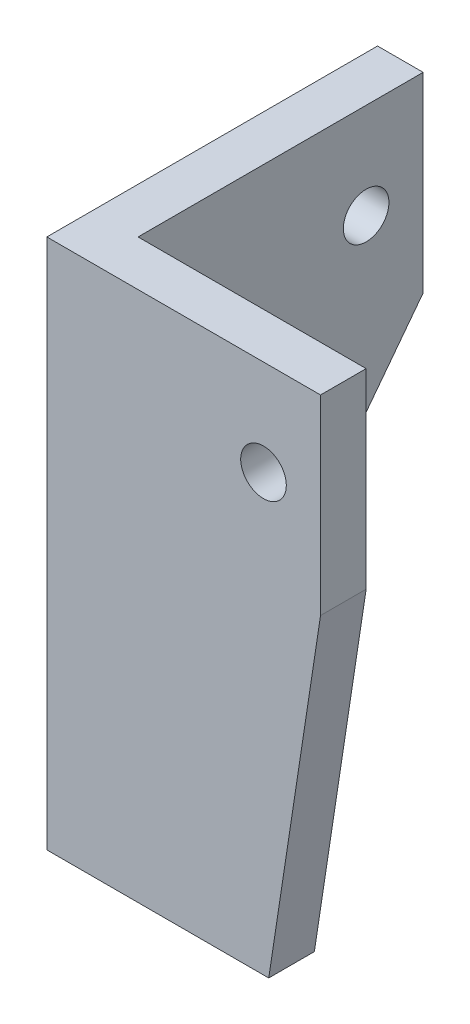
ISO-10303-21;
HEADER;
FILE_DESCRIPTION(('STEP AP214'),'2;1');
FILE_NAME('part.step','',(''),(''),'','','');
FILE_SCHEMA(('AUTOMOTIVE_DESIGN { 1 0 10303 214 1 1 1 1 }'));
ENDSEC;
DATA;
#1=APPLICATION_CONTEXT('core data for automotive mechanical design processes');
#2=APPLICATION_PROTOCOL_DEFINITION('international standard','automotive_design',2000,#1);
#3=PRODUCT_CONTEXT('',#1,'mechanical');
#4=PRODUCT('Part','Part','',(#3));
#5=PRODUCT_RELATED_PRODUCT_CATEGORY('part','',(#4));
#6=PRODUCT_DEFINITION_FORMATION('','',#4);
#7=PRODUCT_DEFINITION_CONTEXT('part definition',#1,'design');
#8=PRODUCT_DEFINITION('design','',#6,#7);
#9=PRODUCT_DEFINITION_SHAPE('','',#8);
#10=(LENGTH_UNIT() NAMED_UNIT(*) SI_UNIT(.MILLI.,.METRE.));
#11=(NAMED_UNIT(*) PLANE_ANGLE_UNIT() SI_UNIT($,.RADIAN.));
#12=(NAMED_UNIT(*) SI_UNIT($,.STERADIAN.) SOLID_ANGLE_UNIT());
#13=UNCERTAINTY_MEASURE_WITH_UNIT(LENGTH_MEASURE(1.E-05),#10,'distance_accuracy_value','');
#14=(GEOMETRIC_REPRESENTATION_CONTEXT(3) GLOBAL_UNCERTAINTY_ASSIGNED_CONTEXT((#13)) GLOBAL_UNIT_ASSIGNED_CONTEXT((#10,
#11,#12)) REPRESENTATION_CONTEXT('',''));
#15=CARTESIAN_POINT('',(0.,0.,0.));
#16=DIRECTION('',(0.,0.,1.));
#17=DIRECTION('',(1.,0.,0.));
#18=AXIS2_PLACEMENT_3D('',#15,#16,#17);
#19=CARTESIAN_POINT('',(-75.0000000000013,-50.549999999998,4.));
#20=DIRECTION('',(-0.988579824496502,0.150698143978172,0.));
#21=DIRECTION('',(-0.150698143978172,-0.988579824496502,0.));
#22=AXIS2_PLACEMENT_3D('',#19,#20,#21);
#23=PLANE('',#22);
#24=DIRECTION('',(0.,0.,1.));
#25=VECTOR('',#24,1.);
#26=CARTESIAN_POINT('',(-74.5426829268303,-47.5499999999977,-25.));
#27=LINE('',#26,#25);
#28=CARTESIAN_POINT('',(-74.5426829268303,-47.5499999999977,0.));
#29=VERTEX_POINT('',#28);
#30=CARTESIAN_POINT('',(-74.5426829268303,-47.5499999999977,4.));
#31=VERTEX_POINT('',#30);
#32=EDGE_CURVE('E136',#29,#31,#27,.T.);
#33=ORIENTED_EDGE('',*,*,#32,.F.);
#34=DIRECTION('',(0.150698143978172,0.988579824496502,0.));
#35=VECTOR('',#34,1.);
#36=CARTESIAN_POINT('',(-75.0000000000013,-50.549999999998,0.));
#37=LINE('',#36,#35);
#38=CARTESIAN_POINT('',(-70.,-17.75,0.));
#39=VERTEX_POINT('',#38);
#40=EDGE_CURVE('E120',#29,#39,#37,.T.);
#41=ORIENTED_EDGE('',*,*,#40,.T.);
#42=DIRECTION('',(0.,0.,-1.));
#43=VECTOR('',#42,1.);
#44=CARTESIAN_POINT('',(-70.,-17.75,4.));
#45=LINE('',#44,#43);
#46=CARTESIAN_POINT('',(-70.,-17.75,4.));
#47=VERTEX_POINT('',#46);
#48=EDGE_CURVE('E40',#47,#39,#45,.T.);
#49=ORIENTED_EDGE('',*,*,#48,.F.);
#50=DIRECTION('',(0.150698143978172,0.988579824496502,0.));
#51=VECTOR('',#50,1.);
#52=CARTESIAN_POINT('',(-75.0000000000013,-50.549999999998,4.));
#53=LINE('',#52,#51);
#54=EDGE_CURVE('E84',#31,#47,#53,.T.);
#55=ORIENTED_EDGE('',*,*,#54,.F.);
#56=EDGE_LOOP('',(#33,#41,#49,#55));
#57=FACE_BOUND('',#56,.T.);
#58=ADVANCED_FACE('F33',(#57),#23,.F.);
#59=CARTESIAN_POINT('',(0.,0.,4.));
#60=DIRECTION('',(0.,0.,-1.));
#61=DIRECTION('',(-1.,0.,0.));
#62=AXIS2_PLACEMENT_3D('',#59,#60,#61);
#63=PLANE('',#62);
#64=CARTESIAN_POINT('',(-75.,-9.37499999999999,4.));
#65=DIRECTION('',(0.,0.,1.));
#66=DIRECTION('',(1.,0.,0.));
#67=AXIS2_PLACEMENT_3D('',#64,#65,#66);
#68=CIRCLE('',#67,2.);
#69=CARTESIAN_POINT('',(-73.,-9.37499999999999,4.));
#70=VERTEX_POINT('',#69);
#71=EDGE_CURVE('E214',#70,#70,#68,.T.);
#72=ORIENTED_EDGE('',*,*,#71,.F.);
#73=EDGE_LOOP('',(#72));
#74=FACE_BOUND('',#73,.T.);
#75=DIRECTION('',(1.,0.,0.));
#76=VECTOR('',#75,1.);
#77=CARTESIAN_POINT('',(0.,-47.5499999999978,4.));
#78=LINE('',#77,#76);
#79=CARTESIAN_POINT('',(-94.,-47.5499999999977,4.));
#80=VERTEX_POINT('',#79);
#81=EDGE_CURVE('E47',#80,#31,#78,.T.);
#82=ORIENTED_EDGE('',*,*,#81,.T.);
#83=ORIENTED_EDGE('',*,*,#54,.T.);
#84=DIRECTION('',(0.,1.,0.));
#85=VECTOR('',#84,1.);
#86=CARTESIAN_POINT('',(-70.,-1.,4.));
#87=LINE('',#86,#85);
#88=CARTESIAN_POINT('',(-70.,-1.,4.));
#89=VERTEX_POINT('',#88);
#90=EDGE_CURVE('E55',#47,#89,#87,.T.);
#91=ORIENTED_EDGE('',*,*,#90,.T.);
#92=DIRECTION('',(-1.,0.,0.));
#93=VECTOR('',#92,1.);
#94=CARTESIAN_POINT('',(-80.,-1.,4.));
#95=LINE('',#94,#93);
#96=CARTESIAN_POINT('',(-94.,-1.,4.));
#97=VERTEX_POINT('',#96);
#98=EDGE_CURVE('E123',#89,#97,#95,.T.);
#99=ORIENTED_EDGE('',*,*,#98,.T.);
#100=DIRECTION('',(0.,1.,0.));
#101=VECTOR('',#100,1.);
#102=CARTESIAN_POINT('',(-94.,-50.549999999998,4.));
#103=LINE('',#102,#101);
#104=EDGE_CURVE('E109',#80,#97,#103,.T.);
#105=ORIENTED_EDGE('',*,*,#104,.F.);
#106=EDGE_LOOP('',(#82,#83,#91,#99,#105));
#107=FACE_BOUND('',#106,.T.);
#108=ADVANCED_FACE('F177',(#74,#107),#63,.F.);
#109=CARTESIAN_POINT('',(0.,0.,0.));
#110=DIRECTION('',(0.,0.,-1.));
#111=DIRECTION('',(-1.,0.,0.));
#112=AXIS2_PLACEMENT_3D('',#109,#110,#111);
#113=PLANE('',#112);
#114=CARTESIAN_POINT('',(-75.,-9.37499999999999,0.));
#115=DIRECTION('',(0.,0.,-1.));
#116=DIRECTION('',(-1.,0.,0.));
#117=AXIS2_PLACEMENT_3D('',#114,#115,#116);
#118=CIRCLE('',#117,2.);
#119=CARTESIAN_POINT('',(-77.,-9.37499999999999,0.));
#120=VERTEX_POINT('',#119);
#121=EDGE_CURVE('E218',#120,#120,#118,.F.);
#122=ORIENTED_EDGE('',*,*,#121,.T.);
#123=EDGE_LOOP('',(#122));
#124=FACE_BOUND('',#123,.T.);
#125=ORIENTED_EDGE('',*,*,#40,.F.);
#126=DIRECTION('',(-1.,0.,0.));
#127=VECTOR('',#126,1.);
#128=CARTESIAN_POINT('',(0.,-47.5499999999978,0.));
#129=LINE('',#128,#127);
#130=CARTESIAN_POINT('',(-90.,-47.5499999999977,0.));
#131=VERTEX_POINT('',#130);
#132=EDGE_CURVE('E80',#29,#131,#129,.T.);
#133=ORIENTED_EDGE('',*,*,#132,.T.);
#134=DIRECTION('',(0.,-1.,0.));
#135=VECTOR('',#134,1.);
#136=CARTESIAN_POINT('',(-90.,-17.75,0.));
#137=LINE('',#136,#135);
#138=CARTESIAN_POINT('',(-90.,-1.,0.));
#139=VERTEX_POINT('',#138);
#140=EDGE_CURVE('E71',#139,#131,#137,.T.);
#141=ORIENTED_EDGE('',*,*,#140,.F.);
#142=DIRECTION('',(-1.,0.,0.));
#143=VECTOR('',#142,1.);
#144=CARTESIAN_POINT('',(-80.,-1.,0.));
#145=LINE('',#144,#143);
#146=CARTESIAN_POINT('',(-70.,-1.,0.));
#147=VERTEX_POINT('',#146);
#148=EDGE_CURVE('E76',#147,#139,#145,.T.);
#149=ORIENTED_EDGE('',*,*,#148,.F.);
#150=DIRECTION('',(0.,1.,0.));
#151=VECTOR('',#150,1.);
#152=CARTESIAN_POINT('',(-70.,-1.,0.));
#153=LINE('',#152,#151);
#154=EDGE_CURVE('E96',#39,#147,#153,.T.);
#155=ORIENTED_EDGE('',*,*,#154,.F.);
#156=EDGE_LOOP('',(#125,#133,#141,#149,#155));
#157=FACE_BOUND('',#156,.T.);
#158=ADVANCED_FACE('F74',(#124,#157),#113,.T.);
#159=CARTESIAN_POINT('',(-90.,0.,0.));
#160=DIRECTION('',(-1.,0.,0.));
#161=DIRECTION('',(0.,0.,1.));
#162=AXIS2_PLACEMENT_3D('',#159,#160,#161);
#163=PLANE('',#162);
#164=CARTESIAN_POINT('',(-90.,-9.37499999999999,-20.));
#165=DIRECTION('',(-1.,0.,0.));
#166=DIRECTION('',(0.,0.,1.));
#167=AXIS2_PLACEMENT_3D('',#164,#165,#166);
#168=CIRCLE('',#167,2.);
#169=CARTESIAN_POINT('',(-90.,-9.37499999999999,-18.));
#170=VERTEX_POINT('',#169);
#171=EDGE_CURVE('E212',#170,#170,#168,.F.);
#172=ORIENTED_EDGE('',*,*,#171,.F.);
#173=EDGE_LOOP('',(#172));
#174=FACE_BOUND('',#173,.T.);
#175=DIRECTION('',(0.,0.,1.));
#176=VECTOR('',#175,1.);
#177=CARTESIAN_POINT('',(-90.,-47.5499999999977,0.));
#178=LINE('',#177,#176);
#179=CARTESIAN_POINT('',(-90.,-47.5499999999977,-2.28658536585404));
#180=VERTEX_POINT('',#179);
#181=EDGE_CURVE('E106',#180,#131,#178,.T.);
#182=ORIENTED_EDGE('',*,*,#181,.F.);
#183=DIRECTION('',(0.,-0.795320383467299,0.606189316667184));
#184=VECTOR('',#183,1.);
#185=CARTESIAN_POINT('',(-90.,-17.7499999999999,-25.));
#186=LINE('',#185,#184);
#187=CARTESIAN_POINT('',(-90.,-17.7499999999999,-25.));
#188=VERTEX_POINT('',#187);
#189=EDGE_CURVE('E104',#188,#180,#186,.T.);
#190=ORIENTED_EDGE('',*,*,#189,.F.);
#191=DIRECTION('',(0.,-1.,0.));
#192=VECTOR('',#191,1.);
#193=CARTESIAN_POINT('',(-90.,-0.999999999999963,-25.));
#194=LINE('',#193,#192);
#195=CARTESIAN_POINT('',(-90.,-0.999999999999963,-25.));
#196=VERTEX_POINT('',#195);
#197=EDGE_CURVE('E102',#196,#188,#194,.T.);
#198=ORIENTED_EDGE('',*,*,#197,.F.);
#199=DIRECTION('',(0.,0.,-1.));
#200=VECTOR('',#199,1.);
#201=CARTESIAN_POINT('',(-90.,-1.,0.));
#202=LINE('',#201,#200);
#203=EDGE_CURVE('E92',#139,#196,#202,.T.);
#204=ORIENTED_EDGE('',*,*,#203,.F.);
#205=ORIENTED_EDGE('',*,*,#140,.T.);
#206=EDGE_LOOP('',(#182,#190,#198,#204,#205));
#207=FACE_BOUND('',#206,.T.);
#208=ADVANCED_FACE('F99',(#174,#207),#163,.F.);
#209=CARTESIAN_POINT('',(-94.,-17.7499999999999,-25.));
#210=DIRECTION('',(0.,0.606189316667184,0.795320383467299));
#211=DIRECTION('',(0.,-0.795320383467299,0.606189316667184));
#212=AXIS2_PLACEMENT_3D('',#209,#210,#211);
#213=PLANE('',#212);
#214=DIRECTION('',(1.,0.,0.));
#215=VECTOR('',#214,1.);
#216=CARTESIAN_POINT('',(-94.,-47.5499999999977,-2.28658536585405));
#217=LINE('',#216,#215);
#218=CARTESIAN_POINT('',(-94.,-47.5499999999977,-2.28658536585406));
#219=VERTEX_POINT('',#218);
#220=EDGE_CURVE('E166',#219,#180,#217,.T.);
#221=ORIENTED_EDGE('',*,*,#220,.F.);
#222=DIRECTION('',(0.,-0.795320383467299,0.606189316667184));
#223=VECTOR('',#222,1.);
#224=CARTESIAN_POINT('',(-94.,-17.7499999999999,-25.));
#225=LINE('',#224,#223);
#226=CARTESIAN_POINT('',(-94.,-17.7499999999999,-25.));
#227=VERTEX_POINT('',#226);
#228=EDGE_CURVE('E165',#227,#219,#225,.T.);
#229=ORIENTED_EDGE('',*,*,#228,.F.);
#230=DIRECTION('',(1.,0.,0.));
#231=VECTOR('',#230,1.);
#232=CARTESIAN_POINT('',(-94.,-17.7499999999999,-25.));
#233=LINE('',#232,#231);
#234=EDGE_CURVE('E115',#227,#188,#233,.T.);
#235=ORIENTED_EDGE('',*,*,#234,.T.);
#236=ORIENTED_EDGE('',*,*,#189,.T.);
#237=EDGE_LOOP('',(#221,#229,#235,#236));
#238=FACE_BOUND('',#237,.T.);
#239=ADVANCED_FACE('F163',(#238),#213,.F.);
#240=CARTESIAN_POINT('',(-94.,0.,0.));
#241=DIRECTION('',(-1.,0.,0.));
#242=DIRECTION('',(0.,0.,1.));
#243=AXIS2_PLACEMENT_3D('',#240,#241,#242);
#244=PLANE('',#243);
#245=CARTESIAN_POINT('',(-94.,-9.37499999999999,-20.));
#246=DIRECTION('',(-1.,0.,0.));
#247=DIRECTION('',(0.,0.,1.));
#248=AXIS2_PLACEMENT_3D('',#245,#246,#247);
#249=CIRCLE('',#248,2.);
#250=CARTESIAN_POINT('',(-94.,-9.37499999999999,-18.));
#251=VERTEX_POINT('',#250);
#252=EDGE_CURVE('E215',#251,#251,#249,.T.);
#253=ORIENTED_EDGE('',*,*,#252,.F.);
#254=EDGE_LOOP('',(#253));
#255=FACE_BOUND('',#254,.T.);
#256=ORIENTED_EDGE('',*,*,#228,.T.);
#257=DIRECTION('',(0.,0.,1.));
#258=VECTOR('',#257,1.);
#259=CARTESIAN_POINT('',(-94.,-47.5499999999977,0.));
#260=LINE('',#259,#258);
#261=EDGE_CURVE('E11',#219,#80,#260,.T.);
#262=ORIENTED_EDGE('',*,*,#261,.T.);
#263=ORIENTED_EDGE('',*,*,#104,.T.);
#264=DIRECTION('',(0.,0.,-1.));
#265=VECTOR('',#264,1.);
#266=CARTESIAN_POINT('',(-94.,-1.,4.));
#267=LINE('',#266,#265);
#268=CARTESIAN_POINT('',(-94.,-0.999999999999963,-25.));
#269=VERTEX_POINT('',#268);
#270=EDGE_CURVE('E114',#97,#269,#267,.T.);
#271=ORIENTED_EDGE('',*,*,#270,.T.);
#272=DIRECTION('',(0.,-1.,0.));
#273=VECTOR('',#272,1.);
#274=CARTESIAN_POINT('',(-94.,-0.999999999999963,-25.));
#275=LINE('',#274,#273);
#276=EDGE_CURVE('E172',#269,#227,#275,.T.);
#277=ORIENTED_EDGE('',*,*,#276,.T.);
#278=EDGE_LOOP('',(#256,#262,#263,#271,#277));
#279=FACE_BOUND('',#278,.T.);
#280=ADVANCED_FACE('F175',(#255,#279),#244,.T.);
#281=CARTESIAN_POINT('',(-70.,-1.,4.));
#282=DIRECTION('',(-1.,0.,0.));
#283=DIRECTION('',(0.,0.,1.));
#284=AXIS2_PLACEMENT_3D('',#281,#282,#283);
#285=PLANE('',#284);
#286=ORIENTED_EDGE('',*,*,#154,.T.);
#287=DIRECTION('',(0.,0.,-1.));
#288=VECTOR('',#287,1.);
#289=CARTESIAN_POINT('',(-70.,-1.,4.));
#290=LINE('',#289,#288);
#291=EDGE_CURVE('E95',#89,#147,#290,.T.);
#292=ORIENTED_EDGE('',*,*,#291,.F.);
#293=ORIENTED_EDGE('',*,*,#90,.F.);
#294=ORIENTED_EDGE('',*,*,#48,.T.);
#295=EDGE_LOOP('',(#286,#292,#293,#294));
#296=FACE_BOUND('',#295,.T.);
#297=ADVANCED_FACE('F130',(#296),#285,.F.);
#298=CARTESIAN_POINT('',(-80.,-1.,4.));
#299=DIRECTION('',(0.,-1.,0.));
#300=DIRECTION('',(0.,0.,-1.));
#301=AXIS2_PLACEMENT_3D('',#298,#299,#300);
#302=PLANE('',#301);
#303=ORIENTED_EDGE('',*,*,#148,.T.);
#304=ORIENTED_EDGE('',*,*,#203,.T.);
#305=DIRECTION('',(1.,0.,0.));
#306=VECTOR('',#305,1.);
#307=CARTESIAN_POINT('',(-94.,-0.999999999999963,-25.));
#308=LINE('',#307,#306);
#309=EDGE_CURVE('E118',#269,#196,#308,.T.);
#310=ORIENTED_EDGE('',*,*,#309,.F.);
#311=ORIENTED_EDGE('',*,*,#270,.F.);
#312=ORIENTED_EDGE('',*,*,#98,.F.);
#313=ORIENTED_EDGE('',*,*,#291,.T.);
#314=EDGE_LOOP('',(#303,#304,#310,#311,#312,#313));
#315=FACE_BOUND('',#314,.T.);
#316=ADVANCED_FACE('F89',(#315),#302,.F.);
#317=CARTESIAN_POINT('',(-94.,-0.999999999999963,-25.));
#318=DIRECTION('',(0.,0.,1.));
#319=DIRECTION('',(0.,-1.,0.));
#320=AXIS2_PLACEMENT_3D('',#317,#318,#319);
#321=PLANE('',#320);
#322=ORIENTED_EDGE('',*,*,#197,.T.);
#323=ORIENTED_EDGE('',*,*,#234,.F.);
#324=ORIENTED_EDGE('',*,*,#276,.F.);
#325=ORIENTED_EDGE('',*,*,#309,.T.);
#326=EDGE_LOOP('',(#322,#323,#324,#325));
#327=FACE_BOUND('',#326,.T.);
#328=ADVANCED_FACE('F158',(#327),#321,.F.);
#329=CARTESIAN_POINT('',(0.,-47.5499999999978,-25.));
#330=DIRECTION('',(0.,-1.,0.));
#331=DIRECTION('',(1.,0.,0.));
#332=AXIS2_PLACEMENT_3D('',#329,#330,#331);
#333=PLANE('',#332);
#334=ORIENTED_EDGE('',*,*,#32,.T.);
#335=ORIENTED_EDGE('',*,*,#81,.F.);
#336=ORIENTED_EDGE('',*,*,#261,.F.);
#337=ORIENTED_EDGE('',*,*,#220,.T.);
#338=ORIENTED_EDGE('',*,*,#181,.T.);
#339=ORIENTED_EDGE('',*,*,#132,.F.);
#340=EDGE_LOOP('',(#334,#335,#336,#337,#338,#339));
#341=FACE_BOUND('',#340,.T.);
#342=ADVANCED_FACE('F204',(#341),#333,.T.);
#343=CARTESIAN_POINT('',(-75.,-9.37499999999999,-5.65685424949238));
#344=DIRECTION('',(0.,0.,1.));
#345=DIRECTION('',(1.,0.,0.));
#346=AXIS2_PLACEMENT_3D('',#343,#344,#345);
#347=CYLINDRICAL_SURFACE('',#346,2.);
#348=ORIENTED_EDGE('',*,*,#71,.T.);
#349=EDGE_LOOP('',(#348));
#350=FACE_BOUND('',#349,.T.);
#351=ORIENTED_EDGE('',*,*,#121,.F.);
#352=EDGE_LOOP('',(#351));
#353=FACE_BOUND('',#352,.T.);
#354=ADVANCED_FACE('F226',(#350,#353),#347,.F.);
#355=CARTESIAN_POINT('',(-84.3431457505076,-9.37499999999999,-20.));
#356=DIRECTION('',(-1.,0.,0.));
#357=DIRECTION('',(0.,0.,1.));
#358=AXIS2_PLACEMENT_3D('',#355,#356,#357);
#359=CYLINDRICAL_SURFACE('',#358,2.);
#360=CARTESIAN_POINT('',(-90.,-9.37499999999999,-18.));
#361=CARTESIAN_POINT('',(-90.0416666666666,-9.37499999999999,-18.));
#362=CARTESIAN_POINT('',(-90.0833333333333,-9.37499999999999,-18.));
#363=CARTESIAN_POINT('',(-90.1666666666666,-9.37499999999999,-18.));
#364=CARTESIAN_POINT('',(-90.2083333333333,-9.37499999999999,-18.));
#365=CARTESIAN_POINT('',(-90.2916666666666,-9.37499999999999,-18.));
#366=CARTESIAN_POINT('',(-90.3333333333333,-9.37499999999999,-18.));
#367=CARTESIAN_POINT('',(-90.4166666666666,-9.37499999999999,-18.));
#368=CARTESIAN_POINT('',(-90.4583333333333,-9.37499999999999,-18.));
#369=CARTESIAN_POINT('',(-90.5416666666666,-9.37499999999999,-18.));
#370=CARTESIAN_POINT('',(-90.5833333333333,-9.37499999999999,-18.));
#371=CARTESIAN_POINT('',(-90.6666666666666,-9.37499999999999,-18.));
#372=CARTESIAN_POINT('',(-90.7083333333333,-9.37499999999999,-18.));
#373=CARTESIAN_POINT('',(-90.7916666666666,-9.37499999999999,-18.));
#374=CARTESIAN_POINT('',(-90.8333333333333,-9.37499999999999,-18.));
#375=CARTESIAN_POINT('',(-90.9166666666666,-9.37499999999999,-18.));
#376=CARTESIAN_POINT('',(-90.9583333333333,-9.37499999999999,-18.));
#377=CARTESIAN_POINT('',(-91.0416666666666,-9.37499999999999,-18.));
#378=CARTESIAN_POINT('',(-91.0833333333333,-9.37499999999999,-18.));
#379=CARTESIAN_POINT('',(-91.1666666666666,-9.37499999999999,-18.));
#380=CARTESIAN_POINT('',(-91.2083333333333,-9.37499999999999,-18.));
#381=CARTESIAN_POINT('',(-91.2916666666666,-9.37499999999999,-18.));
#382=CARTESIAN_POINT('',(-91.3333333333333,-9.37499999999999,-18.));
#383=CARTESIAN_POINT('',(-91.4166666666666,-9.37499999999999,-18.));
#384=CARTESIAN_POINT('',(-91.4583333333333,-9.37499999999999,-18.));
#385=CARTESIAN_POINT('',(-91.5416666666666,-9.37499999999999,-18.));
#386=CARTESIAN_POINT('',(-91.5833333333333,-9.37499999999999,-18.));
#387=CARTESIAN_POINT('',(-91.6666666666666,-9.37499999999999,-18.));
#388=CARTESIAN_POINT('',(-91.7083333333333,-9.37499999999999,-18.));
#389=CARTESIAN_POINT('',(-91.7916666666666,-9.37499999999999,-18.));
#390=CARTESIAN_POINT('',(-91.8333333333333,-9.37499999999999,-18.));
#391=CARTESIAN_POINT('',(-91.9166666666666,-9.37499999999999,-18.));
#392=CARTESIAN_POINT('',(-91.9583333333333,-9.37499999999999,-18.));
#393=CARTESIAN_POINT('',(-92.0416666666666,-9.37499999999999,-18.));
#394=CARTESIAN_POINT('',(-92.0833333333333,-9.37499999999999,-18.));
#395=CARTESIAN_POINT('',(-92.1666666666666,-9.37499999999999,-18.));
#396=CARTESIAN_POINT('',(-92.2083333333333,-9.37499999999999,-18.));
#397=CARTESIAN_POINT('',(-92.2916666666666,-9.37499999999999,-18.));
#398=CARTESIAN_POINT('',(-92.3333333333333,-9.37499999999999,-18.));
#399=CARTESIAN_POINT('',(-92.4166666666666,-9.37499999999999,-18.));
#400=CARTESIAN_POINT('',(-92.4583333333333,-9.37499999999999,-18.));
#401=CARTESIAN_POINT('',(-92.5416666666666,-9.37499999999999,-18.));
#402=CARTESIAN_POINT('',(-92.5833333333333,-9.37499999999999,-18.));
#403=CARTESIAN_POINT('',(-92.6666666666666,-9.37499999999999,-18.));
#404=CARTESIAN_POINT('',(-92.7083333333333,-9.37499999999999,-18.));
#405=CARTESIAN_POINT('',(-92.7916666666666,-9.37499999999999,-18.));
#406=CARTESIAN_POINT('',(-92.8333333333333,-9.37499999999999,-18.));
#407=CARTESIAN_POINT('',(-92.9166666666666,-9.37499999999999,-18.));
#408=CARTESIAN_POINT('',(-92.9583333333333,-9.37499999999999,-18.));
#409=CARTESIAN_POINT('',(-93.0416666666666,-9.37499999999999,-18.));
#410=CARTESIAN_POINT('',(-93.0833333333333,-9.37499999999999,-18.));
#411=CARTESIAN_POINT('',(-93.1666666666666,-9.37499999999999,-18.));
#412=CARTESIAN_POINT('',(-93.2083333333333,-9.37499999999999,-18.));
#413=CARTESIAN_POINT('',(-93.2916666666666,-9.37499999999999,-18.));
#414=CARTESIAN_POINT('',(-93.3333333333333,-9.37499999999999,-18.));
#415=CARTESIAN_POINT('',(-93.4166666666666,-9.37499999999999,-18.));
#416=CARTESIAN_POINT('',(-93.4583333333333,-9.37499999999999,-18.));
#417=CARTESIAN_POINT('',(-93.5416666666666,-9.37499999999999,-18.));
#418=CARTESIAN_POINT('',(-93.5833333333333,-9.37499999999999,-18.));
#419=CARTESIAN_POINT('',(-93.6666666666666,-9.37499999999999,-18.));
#420=CARTESIAN_POINT('',(-93.7083333333333,-9.37499999999999,-18.));
#421=CARTESIAN_POINT('',(-93.7916666666666,-9.37499999999999,-18.));
#422=CARTESIAN_POINT('',(-93.8333333333333,-9.37499999999999,-18.));
#423=CARTESIAN_POINT('',(-93.9166666666666,-9.37499999999999,-18.));
#424=CARTESIAN_POINT('',(-93.9583333333333,-9.37499999999999,-18.));
#425=CARTESIAN_POINT('',(-94.,-9.37499999999999,-18.));
#426=B_SPLINE_CURVE_WITH_KNOTS('',3,(#360,#361,#362,#363,#364,#365,#366,#367,#368,#369,#370,
#371,#372,#373,#374,#375,#376,#377,#378,#379,#380,#381,#382,#383,#384,#385,#386,#387,#388,#389,
#390,#391,#392,#393,#394,#395,#396,#397,#398,#399,#400,#401,#402,#403,#404,#405,#406,#407,#408,
#409,#410,#411,#412,#413,#414,#415,#416,#417,#418,#419,#420,#421,#422,#423,#424,#425),
.UNSPECIFIED.,.F.,.F.,(4,2,2,2,2,2,2,2,2,2,2,2,2,2,2,2,2,2,2,2,2,2,2,2,2,2,2,2,2,2,2,2,4),(0.,
0.125,0.25,0.375,0.5,0.625000000000001,0.750000000000001,0.875000000000001,1.,1.125,1.25,1.375,
1.5,1.625,1.75,1.875,2.,2.125,2.25,2.375,2.5,2.625,2.75,2.875,3.,3.125,3.25,3.375,3.5,3.625,
3.75,3.875,4.),.UNSPECIFIED.);
#427=EDGE_CURVE('BSEAM231',#170,#251,#426,.T.);
#428=ORIENTED_EDGE('',*,*,#171,.T.);
#429=ORIENTED_EDGE('',*,*,#252,.T.);
#430=ORIENTED_EDGE('',*,*,#427,.T.);
#431=ORIENTED_EDGE('',*,*,#427,.F.);
#432=EDGE_LOOP('',(#428,#430,#429,#431));
#433=FACE_BOUND('',#432,.T.);
#434=ADVANCED_FACE('F231',(#433),#359,.F.);
#435=CLOSED_SHELL('',(#58,#108,#158,#208,#239,#280,#297,#316,#328,#342,#354,#434));
#436=MANIFOLD_SOLID_BREP('B2',#435);
#437=ADVANCED_BREP_SHAPE_REPRESENTATION('',(#18,#436),#14);
#438=SHAPE_DEFINITION_REPRESENTATION(#9,#437);
ENDSEC;
END-ISO-10303-21;
